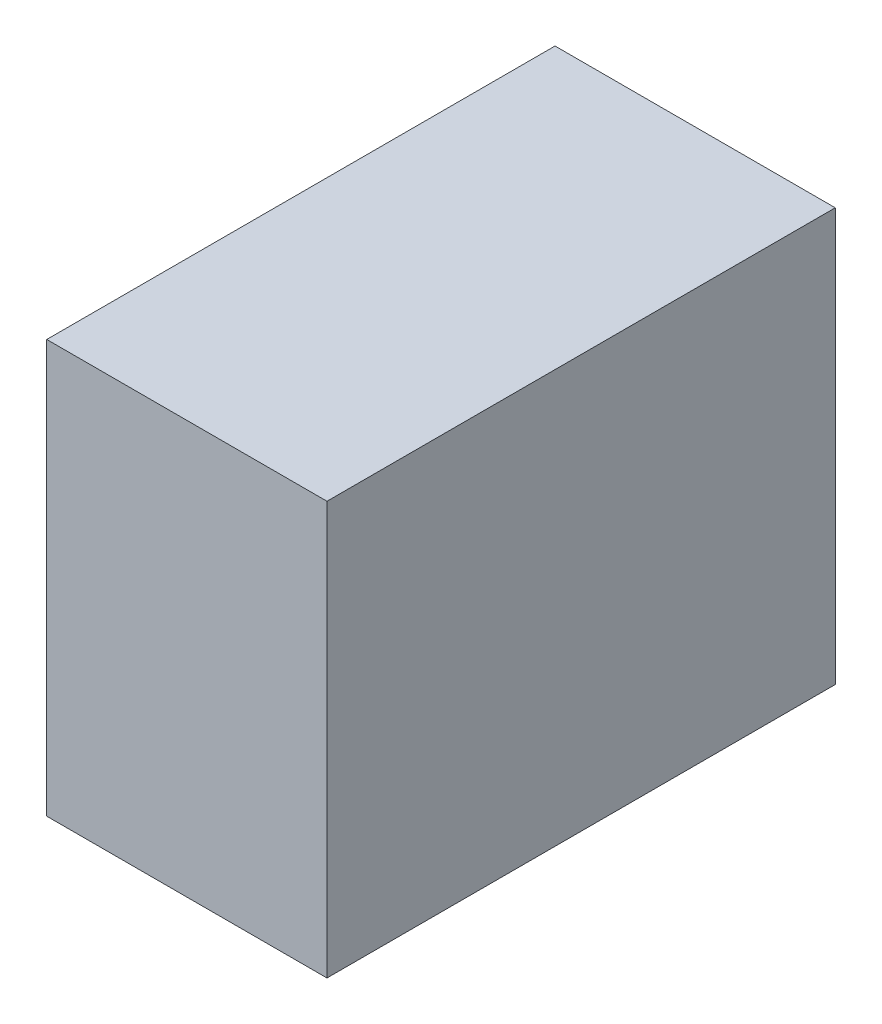
ISO-10303-21;
HEADER;
FILE_DESCRIPTION(('STEP AP214'),'2;1');
FILE_NAME('part.step','',(''),(''),'','','');
FILE_SCHEMA(('AUTOMOTIVE_DESIGN { 1 0 10303 214 1 1 1 1 }'));
ENDSEC;
DATA;
#1=APPLICATION_CONTEXT('core data for automotive mechanical design processes');
#2=APPLICATION_PROTOCOL_DEFINITION('international standard','automotive_design',2000,#1);
#3=PRODUCT_CONTEXT('',#1,'mechanical');
#4=PRODUCT('Part','Part','',(#3));
#5=PRODUCT_RELATED_PRODUCT_CATEGORY('part','',(#4));
#6=PRODUCT_DEFINITION_FORMATION('','',#4);
#7=PRODUCT_DEFINITION_CONTEXT('part definition',#1,'design');
#8=PRODUCT_DEFINITION('design','',#6,#7);
#9=PRODUCT_DEFINITION_SHAPE('','',#8);
#10=(LENGTH_UNIT() NAMED_UNIT(*) SI_UNIT(.MILLI.,.METRE.));
#11=(NAMED_UNIT(*) PLANE_ANGLE_UNIT() SI_UNIT($,.RADIAN.));
#12=(NAMED_UNIT(*) SI_UNIT($,.STERADIAN.) SOLID_ANGLE_UNIT());
#13=UNCERTAINTY_MEASURE_WITH_UNIT(LENGTH_MEASURE(1.E-05),#10,'distance_accuracy_value','');
#14=(GEOMETRIC_REPRESENTATION_CONTEXT(3) GLOBAL_UNCERTAINTY_ASSIGNED_CONTEXT((#13)) GLOBAL_UNIT_ASSIGNED_CONTEXT((#10,
#11,#12)) REPRESENTATION_CONTEXT('',''));
#15=CARTESIAN_POINT('',(0.,0.,0.));
#16=DIRECTION('',(0.,0.,1.));
#17=DIRECTION('',(1.,0.,0.));
#18=AXIS2_PLACEMENT_3D('',#15,#16,#17);
#19=CARTESIAN_POINT('',(37.6,0.,-68.2));
#20=DIRECTION('',(0.,1.,0.));
#21=DIRECTION('',(0.,0.,1.));
#22=AXIS2_PLACEMENT_3D('',#19,#20,#21);
#23=PLANE('',#22);
#24=DIRECTION('',(0.,0.,-1.));
#25=VECTOR('',#24,1.);
#26=CARTESIAN_POINT('',(0.,0.,-68.2));
#27=LINE('',#26,#25);
#28=CARTESIAN_POINT('',(0.,0.,0.));
#29=VERTEX_POINT('',#28);
#30=CARTESIAN_POINT('',(0.,0.,-68.2));
#31=VERTEX_POINT('',#30);
#32=EDGE_CURVE('E98',#29,#31,#27,.T.);
#33=ORIENTED_EDGE('',*,*,#32,.T.);
#34=DIRECTION('',(-1.,0.,0.));
#35=VECTOR('',#34,1.);
#36=CARTESIAN_POINT('',(37.6,0.,-68.2));
#37=LINE('',#36,#35);
#38=CARTESIAN_POINT('',(37.6,0.,-68.2));
#39=VERTEX_POINT('',#38);
#40=EDGE_CURVE('E11',#39,#31,#37,.T.);
#41=ORIENTED_EDGE('',*,*,#40,.F.);
#42=DIRECTION('',(0.,0.,-1.));
#43=VECTOR('',#42,1.);
#44=CARTESIAN_POINT('',(37.6,0.,-68.2));
#45=LINE('',#44,#43);
#46=CARTESIAN_POINT('',(37.6,0.,0.));
#47=VERTEX_POINT('',#46);
#48=EDGE_CURVE('E86',#47,#39,#45,.T.);
#49=ORIENTED_EDGE('',*,*,#48,.F.);
#50=DIRECTION('',(-1.,0.,0.));
#51=VECTOR('',#50,1.);
#52=CARTESIAN_POINT('',(37.6,0.,0.));
#53=LINE('',#52,#51);
#54=EDGE_CURVE('E94',#47,#29,#53,.T.);
#55=ORIENTED_EDGE('',*,*,#54,.T.);
#56=EDGE_LOOP('',(#33,#41,#49,#55));
#57=FACE_BOUND('',#56,.T.);
#58=ADVANCED_FACE('F35',(#57),#23,.F.);
#59=CARTESIAN_POINT('',(37.6,55.4,-68.2));
#60=DIRECTION('',(0.,0.,1.));
#61=DIRECTION('',(1.,0.,0.));
#62=AXIS2_PLACEMENT_3D('',#59,#60,#61);
#63=PLANE('',#62);
#64=DIRECTION('',(0.,1.,0.));
#65=VECTOR('',#64,1.);
#66=CARTESIAN_POINT('',(0.,55.4,-68.2));
#67=LINE('',#66,#65);
#68=CARTESIAN_POINT('',(0.,55.4,-68.2));
#69=VERTEX_POINT('',#68);
#70=EDGE_CURVE('E90',#31,#69,#67,.T.);
#71=ORIENTED_EDGE('',*,*,#70,.T.);
#72=DIRECTION('',(-1.,0.,0.));
#73=VECTOR('',#72,1.);
#74=CARTESIAN_POINT('',(37.6,55.4,-68.2));
#75=LINE('',#74,#73);
#76=CARTESIAN_POINT('',(37.6,55.4,-68.2));
#77=VERTEX_POINT('',#76);
#78=EDGE_CURVE('E43',#77,#69,#75,.T.);
#79=ORIENTED_EDGE('',*,*,#78,.F.);
#80=DIRECTION('',(0.,1.,0.));
#81=VECTOR('',#80,1.);
#82=CARTESIAN_POINT('',(37.6,55.4,-68.2));
#83=LINE('',#82,#81);
#84=EDGE_CURVE('E81',#39,#77,#83,.T.);
#85=ORIENTED_EDGE('',*,*,#84,.F.);
#86=ORIENTED_EDGE('',*,*,#40,.T.);
#87=EDGE_LOOP('',(#71,#79,#85,#86));
#88=FACE_BOUND('',#87,.T.);
#89=ADVANCED_FACE('F89',(#88),#63,.F.);
#90=CARTESIAN_POINT('',(37.6,55.4,0.));
#91=DIRECTION('',(0.,-1.,0.));
#92=DIRECTION('',(0.,0.,-1.));
#93=AXIS2_PLACEMENT_3D('',#90,#91,#92);
#94=PLANE('',#93);
#95=DIRECTION('',(0.,0.,1.));
#96=VECTOR('',#95,1.);
#97=CARTESIAN_POINT('',(0.,55.4,0.));
#98=LINE('',#97,#96);
#99=CARTESIAN_POINT('',(0.,55.4,0.));
#100=VERTEX_POINT('',#99);
#101=EDGE_CURVE('E68',#69,#100,#98,.T.);
#102=ORIENTED_EDGE('',*,*,#101,.T.);
#103=DIRECTION('',(-1.,0.,0.));
#104=VECTOR('',#103,1.);
#105=CARTESIAN_POINT('',(37.6,55.4,0.));
#106=LINE('',#105,#104);
#107=CARTESIAN_POINT('',(37.6,55.4,0.));
#108=VERTEX_POINT('',#107);
#109=EDGE_CURVE('E91',#108,#100,#106,.T.);
#110=ORIENTED_EDGE('',*,*,#109,.F.);
#111=DIRECTION('',(0.,0.,1.));
#112=VECTOR('',#111,1.);
#113=CARTESIAN_POINT('',(37.6,55.4,0.));
#114=LINE('',#113,#112);
#115=EDGE_CURVE('E84',#77,#108,#114,.T.);
#116=ORIENTED_EDGE('',*,*,#115,.F.);
#117=ORIENTED_EDGE('',*,*,#78,.T.);
#118=EDGE_LOOP('',(#102,#110,#116,#117));
#119=FACE_BOUND('',#118,.T.);
#120=ADVANCED_FACE('F92',(#119),#94,.F.);
#121=CARTESIAN_POINT('',(37.6,0.,0.));
#122=DIRECTION('',(0.,0.,-1.));
#123=DIRECTION('',(-1.,0.,0.));
#124=AXIS2_PLACEMENT_3D('',#121,#122,#123);
#125=PLANE('',#124);
#126=DIRECTION('',(0.,-1.,0.));
#127=VECTOR('',#126,1.);
#128=CARTESIAN_POINT('',(0.,0.,0.));
#129=LINE('',#128,#127);
#130=EDGE_CURVE('E74',#100,#29,#129,.T.);
#131=ORIENTED_EDGE('',*,*,#130,.T.);
#132=ORIENTED_EDGE('',*,*,#54,.F.);
#133=DIRECTION('',(0.,-1.,0.));
#134=VECTOR('',#133,1.);
#135=CARTESIAN_POINT('',(37.6,0.,0.));
#136=LINE('',#135,#134);
#137=EDGE_CURVE('E51',#108,#47,#136,.T.);
#138=ORIENTED_EDGE('',*,*,#137,.F.);
#139=ORIENTED_EDGE('',*,*,#109,.T.);
#140=EDGE_LOOP('',(#131,#132,#138,#139));
#141=FACE_BOUND('',#140,.T.);
#142=ADVANCED_FACE('F105',(#141),#125,.F.);
#143=CARTESIAN_POINT('',(37.6,0.,0.));
#144=DIRECTION('',(-1.,0.,0.));
#145=DIRECTION('',(0.,0.,1.));
#146=AXIS2_PLACEMENT_3D('',#143,#144,#145);
#147=PLANE('',#146);
#148=ORIENTED_EDGE('',*,*,#48,.T.);
#149=ORIENTED_EDGE('',*,*,#84,.T.);
#150=ORIENTED_EDGE('',*,*,#115,.T.);
#151=ORIENTED_EDGE('',*,*,#137,.T.);
#152=EDGE_LOOP('',(#148,#149,#150,#151));
#153=FACE_BOUND('',#152,.T.);
#154=ADVANCED_FACE('F82',(#153),#147,.F.);
#155=CARTESIAN_POINT('',(0.,0.,0.));
#156=DIRECTION('',(-1.,0.,0.));
#157=DIRECTION('',(0.,0.,1.));
#158=AXIS2_PLACEMENT_3D('',#155,#156,#157);
#159=PLANE('',#158);
#160=ORIENTED_EDGE('',*,*,#32,.F.);
#161=ORIENTED_EDGE('',*,*,#130,.F.);
#162=ORIENTED_EDGE('',*,*,#101,.F.);
#163=ORIENTED_EDGE('',*,*,#70,.F.);
#164=EDGE_LOOP('',(#160,#161,#162,#163));
#165=FACE_BOUND('',#164,.T.);
#166=ADVANCED_FACE('F108',(#165),#159,.T.);
#167=CLOSED_SHELL('',(#58,#89,#120,#142,#154,#166));
#168=MANIFOLD_SOLID_BREP('B2',#167);
#169=ADVANCED_BREP_SHAPE_REPRESENTATION('',(#18,#168),#14);
#170=SHAPE_DEFINITION_REPRESENTATION(#9,#169);
ENDSEC;
END-ISO-10303-21;
